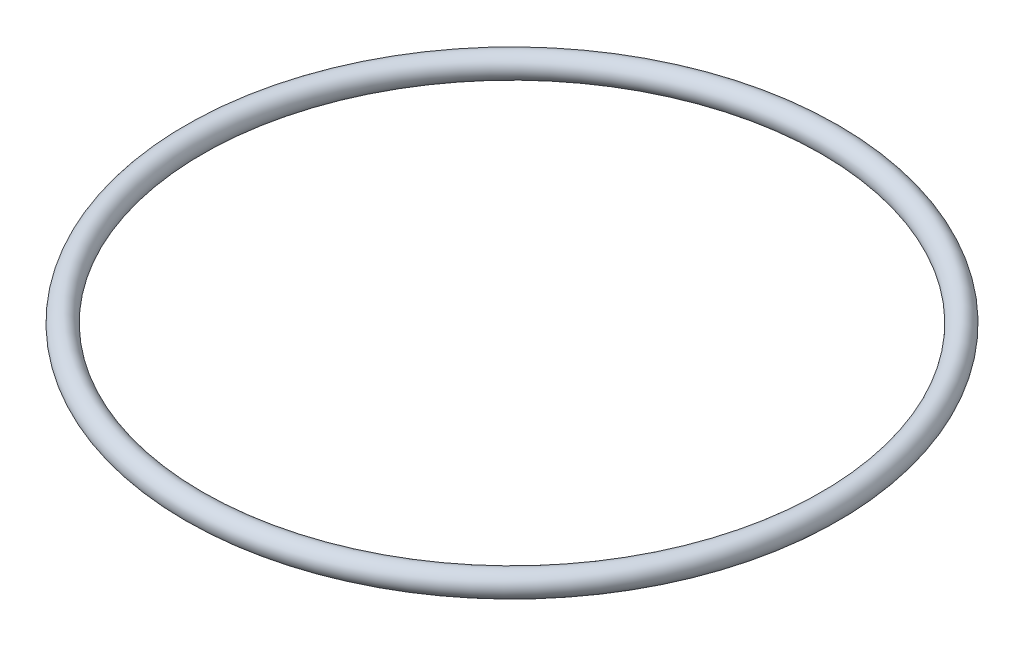
ISO-10303-21;
HEADER;
FILE_DESCRIPTION(('STEP AP214'),'2;1');
FILE_NAME('part.step','',(''),(''),'','','');
FILE_SCHEMA(('AUTOMOTIVE_DESIGN { 1 0 10303 214 1 1 1 1 }'));
ENDSEC;
DATA;
#1=APPLICATION_CONTEXT('core data for automotive mechanical design processes');
#2=APPLICATION_PROTOCOL_DEFINITION('international standard','automotive_design',2000,#1);
#3=PRODUCT_CONTEXT('',#1,'mechanical');
#4=PRODUCT('Part','Part','',(#3));
#5=PRODUCT_RELATED_PRODUCT_CATEGORY('part','',(#4));
#6=PRODUCT_DEFINITION_FORMATION('','',#4);
#7=PRODUCT_DEFINITION_CONTEXT('part definition',#1,'design');
#8=PRODUCT_DEFINITION('design','',#6,#7);
#9=PRODUCT_DEFINITION_SHAPE('','',#8);
#10=(LENGTH_UNIT() NAMED_UNIT(*) SI_UNIT(.MILLI.,.METRE.));
#11=(NAMED_UNIT(*) PLANE_ANGLE_UNIT() SI_UNIT($,.RADIAN.));
#12=(NAMED_UNIT(*) SI_UNIT($,.STERADIAN.) SOLID_ANGLE_UNIT());
#13=UNCERTAINTY_MEASURE_WITH_UNIT(LENGTH_MEASURE(1.E-05),#10,'distance_accuracy_value','');
#14=(GEOMETRIC_REPRESENTATION_CONTEXT(3) GLOBAL_UNCERTAINTY_ASSIGNED_CONTEXT((#13)) GLOBAL_UNIT_ASSIGNED_CONTEXT((#10,
#11,#12)) REPRESENTATION_CONTEXT('',''));
#15=CARTESIAN_POINT('',(0.,0.,0.));
#16=DIRECTION('',(0.,0.,1.));
#17=DIRECTION('',(1.,0.,0.));
#18=AXIS2_PLACEMENT_3D('',#15,#16,#17);
#19=CARTESIAN_POINT('',(0.,0.,0.));
#20=DIRECTION('',(0.,-1.,0.));
#21=DIRECTION('',(0.,0.,-1.));
#22=AXIS2_PLACEMENT_3D('',#19,#20,#21);
#23=TOROIDAL_SURFACE('',#22,13.5,0.500000000000001);
#24=CARTESIAN_POINT('',(0.,0.,-14.));
#25=VERTEX_POINT('',#24);
#26=VERTEX_LOOP('',#25);
#27=FACE_BOUND('',#26,.T.);
#28=ADVANCED_FACE('F33',(#27),#23,.T.);
#29=CLOSED_SHELL('',(#28));
#30=MANIFOLD_SOLID_BREP('B2',#29);
#31=ADVANCED_BREP_SHAPE_REPRESENTATION('',(#18,#30),#14);
#32=SHAPE_DEFINITION_REPRESENTATION(#9,#31);
ENDSEC;
END-ISO-10303-21;
